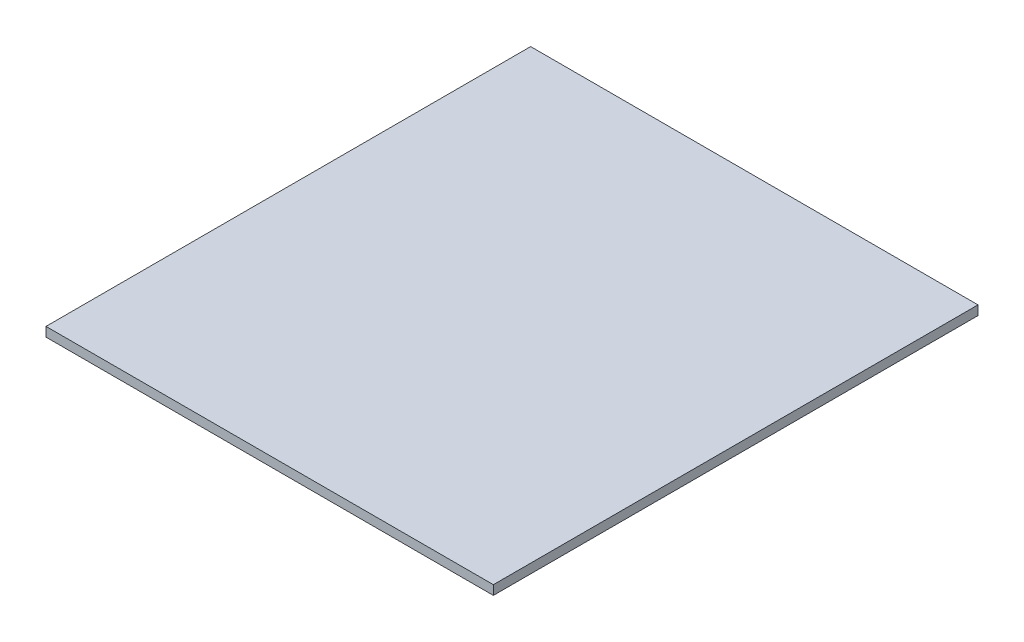
ISO-10303-21;
HEADER;
FILE_DESCRIPTION(('STEP AP214'),'2;1');
FILE_NAME('part.step','',(''),(''),'','','');
FILE_SCHEMA(('AUTOMOTIVE_DESIGN { 1 0 10303 214 1 1 1 1 }'));
ENDSEC;
DATA;
#1=APPLICATION_CONTEXT('core data for automotive mechanical design processes');
#2=APPLICATION_PROTOCOL_DEFINITION('international standard','automotive_design',2000,#1);
#3=PRODUCT_CONTEXT('',#1,'mechanical');
#4=PRODUCT('Part','Part','',(#3));
#5=PRODUCT_RELATED_PRODUCT_CATEGORY('part','',(#4));
#6=PRODUCT_DEFINITION_FORMATION('','',#4);
#7=PRODUCT_DEFINITION_CONTEXT('part definition',#1,'design');
#8=PRODUCT_DEFINITION('design','',#6,#7);
#9=PRODUCT_DEFINITION_SHAPE('','',#8);
#10=(LENGTH_UNIT() NAMED_UNIT(*) SI_UNIT(.MILLI.,.METRE.));
#11=(NAMED_UNIT(*) PLANE_ANGLE_UNIT() SI_UNIT($,.RADIAN.));
#12=(NAMED_UNIT(*) SI_UNIT($,.STERADIAN.) SOLID_ANGLE_UNIT());
#13=UNCERTAINTY_MEASURE_WITH_UNIT(LENGTH_MEASURE(1.E-05),#10,'distance_accuracy_value','');
#14=(GEOMETRIC_REPRESENTATION_CONTEXT(3) GLOBAL_UNCERTAINTY_ASSIGNED_CONTEXT((#13)) GLOBAL_UNIT_ASSIGNED_CONTEXT((#10,
#11,#12)) REPRESENTATION_CONTEXT('',''));
#15=CARTESIAN_POINT('',(0.,0.,0.));
#16=DIRECTION('',(0.,0.,1.));
#17=DIRECTION('',(1.,0.,0.));
#18=AXIS2_PLACEMENT_3D('',#15,#16,#17);
#19=CARTESIAN_POINT('',(152.4,6.35,-165.1));
#20=DIRECTION('',(-1.,0.,0.));
#21=DIRECTION('',(0.,0.,1.));
#22=AXIS2_PLACEMENT_3D('',#19,#20,#21);
#23=PLANE('',#22);
#24=DIRECTION('',(0.,0.,-1.));
#25=VECTOR('',#24,1.);
#26=CARTESIAN_POINT('',(152.4,0.,-165.1));
#27=LINE('',#26,#25);
#28=CARTESIAN_POINT('',(152.4,0.,165.1));
#29=VERTEX_POINT('',#28);
#30=CARTESIAN_POINT('',(152.4,0.,-165.1));
#31=VERTEX_POINT('',#30);
#32=EDGE_CURVE('E98',#29,#31,#27,.T.);
#33=ORIENTED_EDGE('',*,*,#32,.T.);
#34=DIRECTION('',(0.,-1.,0.));
#35=VECTOR('',#34,1.);
#36=CARTESIAN_POINT('',(152.4,6.35,-165.1));
#37=LINE('',#36,#35);
#38=CARTESIAN_POINT('',(152.4,6.35,-165.1));
#39=VERTEX_POINT('',#38);
#40=EDGE_CURVE('E11',#39,#31,#37,.T.);
#41=ORIENTED_EDGE('',*,*,#40,.F.);
#42=DIRECTION('',(0.,0.,-1.));
#43=VECTOR('',#42,1.);
#44=CARTESIAN_POINT('',(152.4,6.35,-165.1));
#45=LINE('',#44,#43);
#46=CARTESIAN_POINT('',(152.4,6.35,165.1));
#47=VERTEX_POINT('',#46);
#48=EDGE_CURVE('E86',#47,#39,#45,.T.);
#49=ORIENTED_EDGE('',*,*,#48,.F.);
#50=DIRECTION('',(0.,-1.,0.));
#51=VECTOR('',#50,1.);
#52=CARTESIAN_POINT('',(152.4,6.35,165.1));
#53=LINE('',#52,#51);
#54=EDGE_CURVE('E94',#47,#29,#53,.T.);
#55=ORIENTED_EDGE('',*,*,#54,.T.);
#56=EDGE_LOOP('',(#33,#41,#49,#55));
#57=FACE_BOUND('',#56,.T.);
#58=ADVANCED_FACE('F35',(#57),#23,.F.);
#59=CARTESIAN_POINT('',(-152.4,6.35,-165.1));
#60=DIRECTION('',(0.,0.,1.));
#61=DIRECTION('',(1.,0.,0.));
#62=AXIS2_PLACEMENT_3D('',#59,#60,#61);
#63=PLANE('',#62);
#64=DIRECTION('',(-1.,0.,0.));
#65=VECTOR('',#64,1.);
#66=CARTESIAN_POINT('',(-152.4,0.,-165.1));
#67=LINE('',#66,#65);
#68=CARTESIAN_POINT('',(-152.4,0.,-165.1));
#69=VERTEX_POINT('',#68);
#70=EDGE_CURVE('E90',#31,#69,#67,.T.);
#71=ORIENTED_EDGE('',*,*,#70,.T.);
#72=DIRECTION('',(0.,-1.,0.));
#73=VECTOR('',#72,1.);
#74=CARTESIAN_POINT('',(-152.4,6.35,-165.1));
#75=LINE('',#74,#73);
#76=CARTESIAN_POINT('',(-152.4,6.35,-165.1));
#77=VERTEX_POINT('',#76);
#78=EDGE_CURVE('E43',#77,#69,#75,.T.);
#79=ORIENTED_EDGE('',*,*,#78,.F.);
#80=DIRECTION('',(-1.,0.,0.));
#81=VECTOR('',#80,1.);
#82=CARTESIAN_POINT('',(-152.4,6.35,-165.1));
#83=LINE('',#82,#81);
#84=EDGE_CURVE('E81',#39,#77,#83,.T.);
#85=ORIENTED_EDGE('',*,*,#84,.F.);
#86=ORIENTED_EDGE('',*,*,#40,.T.);
#87=EDGE_LOOP('',(#71,#79,#85,#86));
#88=FACE_BOUND('',#87,.T.);
#89=ADVANCED_FACE('F89',(#88),#63,.F.);
#90=CARTESIAN_POINT('',(-152.4,6.35,-165.1));
#91=DIRECTION('',(1.,0.,0.));
#92=DIRECTION('',(0.,0.,-1.));
#93=AXIS2_PLACEMENT_3D('',#90,#91,#92);
#94=PLANE('',#93);
#95=DIRECTION('',(0.,0.,1.));
#96=VECTOR('',#95,1.);
#97=CARTESIAN_POINT('',(-152.4,0.,-165.1));
#98=LINE('',#97,#96);
#99=CARTESIAN_POINT('',(-152.4,0.,165.1));
#100=VERTEX_POINT('',#99);
#101=EDGE_CURVE('E68',#69,#100,#98,.T.);
#102=ORIENTED_EDGE('',*,*,#101,.T.);
#103=DIRECTION('',(0.,-1.,0.));
#104=VECTOR('',#103,1.);
#105=CARTESIAN_POINT('',(-152.4,6.35,165.1));
#106=LINE('',#105,#104);
#107=CARTESIAN_POINT('',(-152.4,6.35,165.1));
#108=VERTEX_POINT('',#107);
#109=EDGE_CURVE('E91',#108,#100,#106,.T.);
#110=ORIENTED_EDGE('',*,*,#109,.F.);
#111=DIRECTION('',(0.,0.,1.));
#112=VECTOR('',#111,1.);
#113=CARTESIAN_POINT('',(-152.4,6.35,-165.1));
#114=LINE('',#113,#112);
#115=EDGE_CURVE('E84',#77,#108,#114,.T.);
#116=ORIENTED_EDGE('',*,*,#115,.F.);
#117=ORIENTED_EDGE('',*,*,#78,.T.);
#118=EDGE_LOOP('',(#102,#110,#116,#117));
#119=FACE_BOUND('',#118,.T.);
#120=ADVANCED_FACE('F92',(#119),#94,.F.);
#121=CARTESIAN_POINT('',(-152.4,6.35,165.1));
#122=DIRECTION('',(0.,0.,-1.));
#123=DIRECTION('',(-1.,0.,0.));
#124=AXIS2_PLACEMENT_3D('',#121,#122,#123);
#125=PLANE('',#124);
#126=DIRECTION('',(1.,0.,0.));
#127=VECTOR('',#126,1.);
#128=CARTESIAN_POINT('',(-152.4,0.,165.1));
#129=LINE('',#128,#127);
#130=EDGE_CURVE('E74',#100,#29,#129,.T.);
#131=ORIENTED_EDGE('',*,*,#130,.T.);
#132=ORIENTED_EDGE('',*,*,#54,.F.);
#133=DIRECTION('',(1.,0.,0.));
#134=VECTOR('',#133,1.);
#135=CARTESIAN_POINT('',(-152.4,6.35,165.1));
#136=LINE('',#135,#134);
#137=EDGE_CURVE('E51',#108,#47,#136,.T.);
#138=ORIENTED_EDGE('',*,*,#137,.F.);
#139=ORIENTED_EDGE('',*,*,#109,.T.);
#140=EDGE_LOOP('',(#131,#132,#138,#139));
#141=FACE_BOUND('',#140,.T.);
#142=ADVANCED_FACE('F105',(#141),#125,.F.);
#143=CARTESIAN_POINT('',(0.,6.35,0.));
#144=DIRECTION('',(0.,1.,0.));
#145=DIRECTION('',(0.,0.,1.));
#146=AXIS2_PLACEMENT_3D('',#143,#144,#145);
#147=PLANE('',#146);
#148=ORIENTED_EDGE('',*,*,#48,.T.);
#149=ORIENTED_EDGE('',*,*,#84,.T.);
#150=ORIENTED_EDGE('',*,*,#115,.T.);
#151=ORIENTED_EDGE('',*,*,#137,.T.);
#152=EDGE_LOOP('',(#148,#149,#150,#151));
#153=FACE_BOUND('',#152,.T.);
#154=ADVANCED_FACE('F82',(#153),#147,.T.);
#155=CARTESIAN_POINT('',(0.,0.,0.));
#156=DIRECTION('',(0.,1.,0.));
#157=DIRECTION('',(0.,0.,1.));
#158=AXIS2_PLACEMENT_3D('',#155,#156,#157);
#159=PLANE('',#158);
#160=ORIENTED_EDGE('',*,*,#32,.F.);
#161=ORIENTED_EDGE('',*,*,#130,.F.);
#162=ORIENTED_EDGE('',*,*,#101,.F.);
#163=ORIENTED_EDGE('',*,*,#70,.F.);
#164=EDGE_LOOP('',(#160,#161,#162,#163));
#165=FACE_BOUND('',#164,.T.);
#166=ADVANCED_FACE('F108',(#165),#159,.F.);
#167=CLOSED_SHELL('',(#58,#89,#120,#142,#154,#166));
#168=MANIFOLD_SOLID_BREP('B2',#167);
#169=ADVANCED_BREP_SHAPE_REPRESENTATION('',(#18,#168),#14);
#170=SHAPE_DEFINITION_REPRESENTATION(#9,#169);
ENDSEC;
END-ISO-10303-21;
